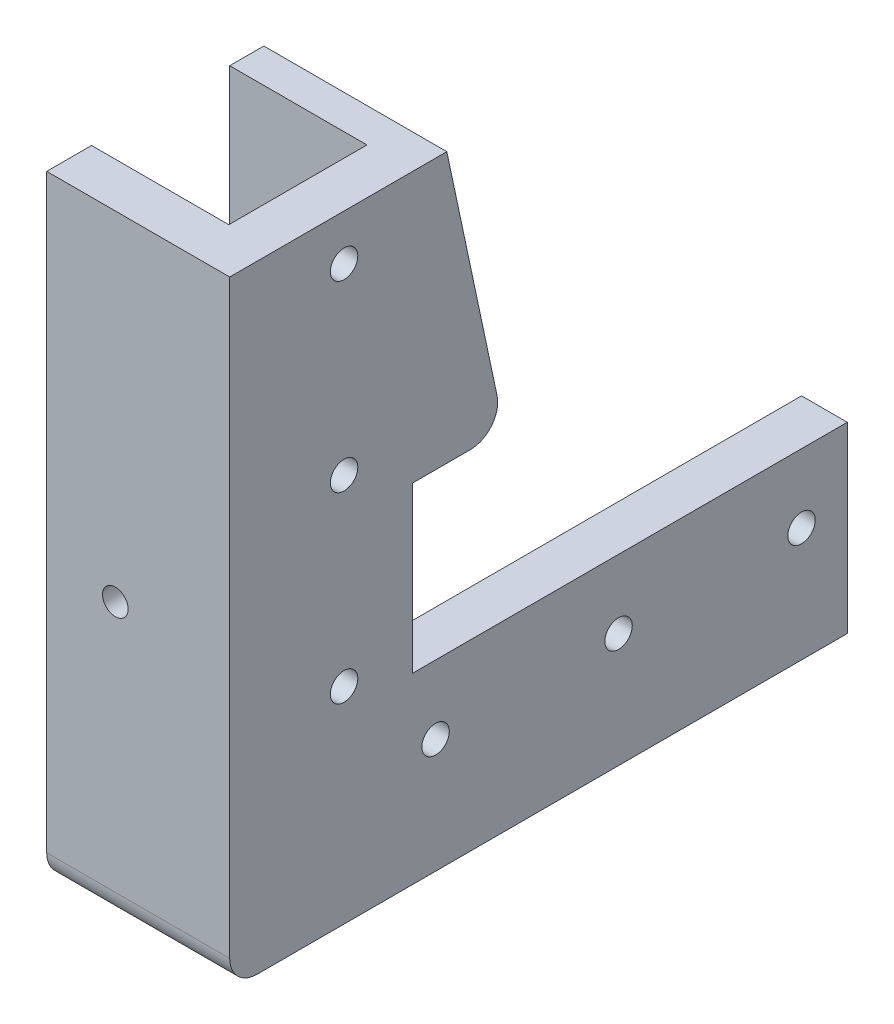
ISO-10303-21;
HEADER;
FILE_DESCRIPTION(('STEP AP214'),'2;1');
FILE_NAME('part.step','',(''),(''),'','','');
FILE_SCHEMA(('AUTOMOTIVE_DESIGN { 1 0 10303 214 1 1 1 1 }'));
ENDSEC;
DATA;
#1=APPLICATION_CONTEXT('core data for automotive mechanical design processes');
#2=APPLICATION_PROTOCOL_DEFINITION('international standard','automotive_design',2000,#1);
#3=PRODUCT_CONTEXT('',#1,'mechanical');
#4=PRODUCT('Part','Part','',(#3));
#5=PRODUCT_RELATED_PRODUCT_CATEGORY('part','',(#4));
#6=PRODUCT_DEFINITION_FORMATION('','',#4);
#7=PRODUCT_DEFINITION_CONTEXT('part definition',#1,'design');
#8=PRODUCT_DEFINITION('design','',#6,#7);
#9=PRODUCT_DEFINITION_SHAPE('','',#8);
#10=(LENGTH_UNIT() NAMED_UNIT(*) SI_UNIT(.MILLI.,.METRE.));
#11=(NAMED_UNIT(*) PLANE_ANGLE_UNIT() SI_UNIT($,.RADIAN.));
#12=(NAMED_UNIT(*) SI_UNIT($,.STERADIAN.) SOLID_ANGLE_UNIT());
#13=UNCERTAINTY_MEASURE_WITH_UNIT(LENGTH_MEASURE(1.E-05),#10,'distance_accuracy_value','');
#14=(GEOMETRIC_REPRESENTATION_CONTEXT(3) GLOBAL_UNCERTAINTY_ASSIGNED_CONTEXT((#13)) GLOBAL_UNIT_ASSIGNED_CONTEXT((#10,
#11,#12)) REPRESENTATION_CONTEXT('',''));
#15=CARTESIAN_POINT('',(0.,0.,0.));
#16=DIRECTION('',(0.,0.,1.));
#17=DIRECTION('',(1.,0.,0.));
#18=AXIS2_PLACEMENT_3D('',#15,#16,#17);
#19=CARTESIAN_POINT('',(0.,0.,0.));
#20=DIRECTION('',(-1.,0.,0.));
#21=DIRECTION('',(0.,0.,1.));
#22=AXIS2_PLACEMENT_3D('',#19,#20,#21);
#23=PLANE('',#22);
#24=DIRECTION('',(0.,0.,-1.));
#25=VECTOR('',#24,1.);
#26=CARTESIAN_POINT('',(0.,-12.5,12.5));
#27=LINE('',#26,#25);
#28=CARTESIAN_POINT('',(0.,-12.5,9.5));
#29=VERTEX_POINT('',#28);
#30=CARTESIAN_POINT('',(0.,-12.5,-55.));
#31=VERTEX_POINT('',#30);
#32=EDGE_CURVE('E238',#29,#31,#27,.T.);
#33=ORIENTED_EDGE('',*,*,#32,.F.);
#34=CARTESIAN_POINT('',(0.,-9.5,9.5));
#35=DIRECTION('',(-1.,0.,0.));
#36=DIRECTION('',(0.,0.,1.));
#37=AXIS2_PLACEMENT_3D('',#34,#35,#36);
#38=CIRCLE('',#37,3.);
#39=CARTESIAN_POINT('',(0.,-9.5,12.5));
#40=VERTEX_POINT('',#39);
#41=EDGE_CURVE('E42',#29,#40,#38,.T.);
#42=ORIENTED_EDGE('',*,*,#41,.T.);
#43=DIRECTION('',(0.,-1.,0.));
#44=VECTOR('',#43,1.);
#45=CARTESIAN_POINT('',(0.,-12.5,12.5));
#46=LINE('',#45,#44);
#47=CARTESIAN_POINT('',(0.,55.,12.5));
#48=VERTEX_POINT('',#47);
#49=EDGE_CURVE('E236',#48,#40,#46,.T.);
#50=ORIENTED_EDGE('',*,*,#49,.F.);
#51=DIRECTION('',(0.,0.,1.));
#52=VECTOR('',#51,1.);
#53=CARTESIAN_POINT('',(0.,55.,-11.2295814307343));
#54=LINE('',#53,#52);
#55=CARTESIAN_POINT('',(0.,55.,7.6));
#56=VERTEX_POINT('',#55);
#57=EDGE_CURVE('E234',#56,#48,#54,.T.);
#58=ORIENTED_EDGE('',*,*,#57,.F.);
#59=DIRECTION('',(0.,1.,0.));
#60=VECTOR('',#59,1.);
#61=CARTESIAN_POINT('',(0.,55.,7.6));
#62=LINE('',#61,#60);
#63=CARTESIAN_POINT('',(0.,-7.59999999999999,7.60000000000001));
#64=VERTEX_POINT('',#63);
#65=EDGE_CURVE('E158',#64,#56,#62,.T.);
#66=ORIENTED_EDGE('',*,*,#65,.F.);
#67=DIRECTION('',(0.,0.,1.));
#68=VECTOR('',#67,1.);
#69=CARTESIAN_POINT('',(0.,-7.59999999999999,7.60000000000001));
#70=LINE('',#69,#68);
#71=CARTESIAN_POINT('',(0.,-7.6,-55.));
#72=VERTEX_POINT('',#71);
#73=EDGE_CURVE('E282',#72,#64,#70,.T.);
#74=ORIENTED_EDGE('',*,*,#73,.F.);
#75=DIRECTION('',(0.,1.,0.));
#76=VECTOR('',#75,1.);
#77=CARTESIAN_POINT('',(0.,-12.5,-55.));
#78=LINE('',#77,#76);
#79=EDGE_CURVE('E213',#31,#72,#78,.T.);
#80=ORIENTED_EDGE('',*,*,#79,.F.);
#81=EDGE_LOOP('',(#33,#42,#50,#58,#66,#74,#80));
#82=FACE_BOUND('',#81,.T.);
#83=ADVANCED_FACE('F34',(#82),#23,.T.);
#84=CARTESIAN_POINT('',(20.,0.,0.));
#85=DIRECTION('',(-1.,0.,0.));
#86=DIRECTION('',(0.,0.,1.));
#87=AXIS2_PLACEMENT_3D('',#84,#85,#86);
#88=PLANE('',#87);
#89=DIRECTION('',(0.,0.,-1.));
#90=VECTOR('',#89,1.);
#91=CARTESIAN_POINT('',(20.,25.5,-7.5));
#92=LINE('',#91,#90);
#93=CARTESIAN_POINT('',(20.,25.5,-7.5));
#94=VERTEX_POINT('',#93);
#95=CARTESIAN_POINT('',(20.,25.5,-13.7953085303948));
#96=VERTEX_POINT('',#95);
#97=EDGE_CURVE('E212',#94,#96,#92,.T.);
#98=ORIENTED_EDGE('',*,*,#97,.T.);
#99=CARTESIAN_POINT('',(20.,28.5,-13.7953085303948));
#100=DIRECTION('',(-1.,0.,0.));
#101=DIRECTION('',(0.,0.,1.));
#102=AXIS2_PLACEMENT_3D('',#99,#100,#101);
#103=CIRCLE('',#102,3.);
#104=CARTESIAN_POINT('',(20.,29.1237350724533,-16.7297513325963));
#105=VERTEX_POINT('',#104);
#106=EDGE_CURVE('E270',#96,#105,#103,.F.);
#107=ORIENTED_EDGE('',*,*,#106,.T.);
#108=DIRECTION('',(0.,0.978147600733806,0.20791169081776));
#109=VECTOR('',#108,1.);
#110=CARTESIAN_POINT('',(20.,25.5,-17.5));
#111=LINE('',#110,#109);
#112=CARTESIAN_POINT('',(20.,55.,-11.2295814307343));
#113=VERTEX_POINT('',#112);
#114=EDGE_CURVE('E216',#105,#113,#111,.T.);
#115=ORIENTED_EDGE('',*,*,#114,.T.);
#116=DIRECTION('',(0.,0.,1.));
#117=VECTOR('',#116,1.);
#118=CARTESIAN_POINT('',(20.,55.,-11.2295814307343));
#119=LINE('',#118,#117);
#120=CARTESIAN_POINT('',(20.,55.,12.5));
#121=VERTEX_POINT('',#120);
#122=EDGE_CURVE('E218',#113,#121,#119,.T.);
#123=ORIENTED_EDGE('',*,*,#122,.T.);
#124=DIRECTION('',(0.,-1.,0.));
#125=VECTOR('',#124,1.);
#126=CARTESIAN_POINT('',(20.,-12.5,12.5));
#127=LINE('',#126,#125);
#128=CARTESIAN_POINT('',(20.,-9.5,12.5));
#129=VERTEX_POINT('',#128);
#130=EDGE_CURVE('E220',#121,#129,#127,.T.);
#131=ORIENTED_EDGE('',*,*,#130,.T.);
#132=CARTESIAN_POINT('',(20.,-9.5,9.5));
#133=DIRECTION('',(-1.,0.,0.));
#134=DIRECTION('',(0.,0.,1.));
#135=AXIS2_PLACEMENT_3D('',#132,#133,#134);
#136=CIRCLE('',#135,3.);
#137=CARTESIAN_POINT('',(20.,-12.5,9.5));
#138=VERTEX_POINT('',#137);
#139=EDGE_CURVE('E268',#129,#138,#136,.F.);
#140=ORIENTED_EDGE('',*,*,#139,.T.);
#141=DIRECTION('',(0.,0.,-1.));
#142=VECTOR('',#141,1.);
#143=CARTESIAN_POINT('',(20.,-12.5,12.5));
#144=LINE('',#143,#142);
#145=CARTESIAN_POINT('',(20.,-12.5,-55.));
#146=VERTEX_POINT('',#145);
#147=EDGE_CURVE('E223',#138,#146,#144,.T.);
#148=ORIENTED_EDGE('',*,*,#147,.T.);
#149=DIRECTION('',(0.,1.,0.));
#150=VECTOR('',#149,1.);
#151=CARTESIAN_POINT('',(20.,-12.5,-55.));
#152=LINE('',#151,#150);
#153=CARTESIAN_POINT('',(20.,7.5,-55.));
#154=VERTEX_POINT('',#153);
#155=EDGE_CURVE('E225',#146,#154,#152,.T.);
#156=ORIENTED_EDGE('',*,*,#155,.T.);
#157=DIRECTION('',(0.,0.,1.));
#158=VECTOR('',#157,1.);
#159=CARTESIAN_POINT('',(20.,7.5,-55.));
#160=LINE('',#159,#158);
#161=CARTESIAN_POINT('',(20.,7.5,-7.5));
#162=VERTEX_POINT('',#161);
#163=EDGE_CURVE('E227',#154,#162,#160,.T.);
#164=ORIENTED_EDGE('',*,*,#163,.T.);
#165=DIRECTION('',(0.,1.,0.));
#166=VECTOR('',#165,1.);
#167=CARTESIAN_POINT('',(20.,7.5,-7.5));
#168=LINE('',#167,#166);
#169=EDGE_CURVE('E209',#162,#94,#168,.T.);
#170=ORIENTED_EDGE('',*,*,#169,.T.);
#171=EDGE_LOOP('',(#98,#107,#115,#123,#131,#140,#148,#156,#164,#170));
#172=FACE_BOUND('',#171,.T.);
#173=CARTESIAN_POINT('',(20.,10.,0.));
#174=DIRECTION('',(1.,0.,0.));
#175=DIRECTION('',(0.,0.,-1.));
#176=AXIS2_PLACEMENT_3D('',#173,#174,#175);
#177=CIRCLE('',#176,1.5);
#178=CARTESIAN_POINT('',(20.,10.,-1.5));
#179=VERTEX_POINT('',#178);
#180=EDGE_CURVE('E205',#179,#179,#177,.T.);
#181=ORIENTED_EDGE('',*,*,#180,.F.);
#182=EDGE_LOOP('',(#181));
#183=FACE_BOUND('',#182,.T.);
#184=CARTESIAN_POINT('',(20.,30.,0.));
#185=DIRECTION('',(1.,0.,0.));
#186=DIRECTION('',(0.,0.,-1.));
#187=AXIS2_PLACEMENT_3D('',#184,#185,#186);
#188=CIRCLE('',#187,1.5);
#189=CARTESIAN_POINT('',(20.,30.,-1.5));
#190=VERTEX_POINT('',#189);
#191=EDGE_CURVE('E202',#190,#190,#188,.T.);
#192=ORIENTED_EDGE('',*,*,#191,.F.);
#193=EDGE_LOOP('',(#192));
#194=FACE_BOUND('',#193,.T.);
#195=CARTESIAN_POINT('',(20.,0.,-10.));
#196=DIRECTION('',(1.,0.,0.));
#197=DIRECTION('',(0.,0.,-1.));
#198=AXIS2_PLACEMENT_3D('',#195,#196,#197);
#199=CIRCLE('',#198,1.5);
#200=CARTESIAN_POINT('',(20.,0.,-11.5));
#201=VERTEX_POINT('',#200);
#202=EDGE_CURVE('E199',#201,#201,#199,.T.);
#203=ORIENTED_EDGE('',*,*,#202,.F.);
#204=EDGE_LOOP('',(#203));
#205=FACE_BOUND('',#204,.T.);
#206=CARTESIAN_POINT('',(20.,0.,-30.));
#207=DIRECTION('',(1.,0.,0.));
#208=DIRECTION('',(0.,0.,-1.));
#209=AXIS2_PLACEMENT_3D('',#206,#207,#208);
#210=CIRCLE('',#209,1.5);
#211=CARTESIAN_POINT('',(20.,0.,-31.5));
#212=VERTEX_POINT('',#211);
#213=EDGE_CURVE('E196',#212,#212,#210,.T.);
#214=ORIENTED_EDGE('',*,*,#213,.F.);
#215=EDGE_LOOP('',(#214));
#216=FACE_BOUND('',#215,.T.);
#217=CARTESIAN_POINT('',(20.,0.,-50.));
#218=DIRECTION('',(1.,0.,0.));
#219=DIRECTION('',(0.,0.,-1.));
#220=AXIS2_PLACEMENT_3D('',#217,#218,#219);
#221=CIRCLE('',#220,1.5);
#222=CARTESIAN_POINT('',(20.,0.,-51.5));
#223=VERTEX_POINT('',#222);
#224=EDGE_CURVE('E193',#223,#223,#221,.T.);
#225=ORIENTED_EDGE('',*,*,#224,.F.);
#226=EDGE_LOOP('',(#225));
#227=FACE_BOUND('',#226,.T.);
#228=CARTESIAN_POINT('',(20.,50.,0.));
#229=DIRECTION('',(1.,0.,0.));
#230=DIRECTION('',(0.,0.,-1.));
#231=AXIS2_PLACEMENT_3D('',#228,#229,#230);
#232=CIRCLE('',#231,1.5);
#233=CARTESIAN_POINT('',(20.,50.,-1.5));
#234=VERTEX_POINT('',#233);
#235=EDGE_CURVE('E190',#234,#234,#232,.T.);
#236=ORIENTED_EDGE('',*,*,#235,.F.);
#237=EDGE_LOOP('',(#236));
#238=FACE_BOUND('',#237,.T.);
#239=ADVANCED_FACE('F291',(#172,#183,#194,#205,#216,#227,#238),#88,.F.);
#240=DIRECTION('',(0.,0.978147600733806,0.20791169081776));
#241=VECTOR('',#240,1.);
#242=CARTESIAN_POINT('',(0.,25.5,-17.5));
#243=LINE('',#242,#241);
#244=CARTESIAN_POINT('',(0.,29.1237350724533,-16.7297513325963));
#245=VERTEX_POINT('',#244);
#246=CARTESIAN_POINT('',(0.,55.,-11.2295814307343));
#247=VERTEX_POINT('',#246);
#248=EDGE_CURVE('E232',#245,#247,#243,.T.);
#249=ORIENTED_EDGE('',*,*,#248,.F.);
#250=CARTESIAN_POINT('',(0.,28.5,-13.7953085303948));
#251=DIRECTION('',(-1.,0.,0.));
#252=DIRECTION('',(0.,0.,1.));
#253=AXIS2_PLACEMENT_3D('',#250,#251,#252);
#254=CIRCLE('',#253,3.);
#255=CARTESIAN_POINT('',(0.,25.5,-13.7953085303948));
#256=VERTEX_POINT('',#255);
#257=EDGE_CURVE('E264',#245,#256,#254,.T.);
#258=ORIENTED_EDGE('',*,*,#257,.T.);
#259=DIRECTION('',(0.,0.,-1.));
#260=VECTOR('',#259,1.);
#261=CARTESIAN_POINT('',(0.,25.5,-7.5));
#262=LINE('',#261,#260);
#263=CARTESIAN_POINT('',(0.,25.5,-7.5));
#264=VERTEX_POINT('',#263);
#265=EDGE_CURVE('E208',#264,#256,#262,.T.);
#266=ORIENTED_EDGE('',*,*,#265,.F.);
#267=DIRECTION('',(0.,-1.,0.));
#268=VECTOR('',#267,1.);
#269=CARTESIAN_POINT('',(0.,7.5,-7.5));
#270=LINE('',#269,#268);
#271=CARTESIAN_POINT('',(0.,55.,-7.5));
#272=VERTEX_POINT('',#271);
#273=EDGE_CURVE('E305',#272,#264,#270,.T.);
#274=ORIENTED_EDGE('',*,*,#273,.F.);
#275=EDGE_CURVE('E164',#247,#272,#54,.T.);
#276=ORIENTED_EDGE('',*,*,#275,.F.);
#277=EDGE_LOOP('',(#249,#258,#266,#274,#276));
#278=FACE_BOUND('',#277,.T.);
#279=ADVANCED_FACE('F350',(#278),#23,.T.);
#280=CARTESIAN_POINT('',(20.,7.5,-7.5));
#281=DIRECTION('',(0.,0.,1.));
#282=DIRECTION('',(1.,0.,0.));
#283=AXIS2_PLACEMENT_3D('',#280,#281,#282);
#284=PLANE('',#283);
#285=DIRECTION('',(-1.,0.,0.));
#286=VECTOR('',#285,1.);
#287=CARTESIAN_POINT('',(20.,7.5,-7.5));
#288=LINE('',#287,#286);
#289=CARTESIAN_POINT('',(15.,7.5,-7.5));
#290=VERTEX_POINT('',#289);
#291=EDGE_CURVE('E229',#162,#290,#288,.T.);
#292=ORIENTED_EDGE('',*,*,#291,.T.);
#293=DIRECTION('',(0.,-1.,0.));
#294=VECTOR('',#293,1.);
#295=CARTESIAN_POINT('',(15.,7.5,-7.5));
#296=LINE('',#295,#294);
#297=CARTESIAN_POINT('',(15.,25.5,-7.5));
#298=VERTEX_POINT('',#297);
#299=EDGE_CURVE('E147',#298,#290,#296,.T.);
#300=ORIENTED_EDGE('',*,*,#299,.F.);
#301=DIRECTION('',(-1.,0.,0.));
#302=VECTOR('',#301,1.);
#303=CARTESIAN_POINT('',(20.,25.5,-7.5));
#304=LINE('',#303,#302);
#305=EDGE_CURVE('E255',#94,#298,#304,.T.);
#306=ORIENTED_EDGE('',*,*,#305,.F.);
#307=ORIENTED_EDGE('',*,*,#169,.F.);
#308=EDGE_LOOP('',(#292,#300,#306,#307));
#309=FACE_BOUND('',#308,.T.);
#310=ADVANCED_FACE('F338',(#309),#284,.F.);
#311=CARTESIAN_POINT('',(20.,25.5,-7.5));
#312=DIRECTION('',(0.,1.,0.));
#313=DIRECTION('',(0.,0.,1.));
#314=AXIS2_PLACEMENT_3D('',#311,#312,#313);
#315=PLANE('',#314);
#316=ORIENTED_EDGE('',*,*,#265,.T.);
#317=DIRECTION('',(-1.,0.,0.));
#318=VECTOR('',#317,1.);
#319=CARTESIAN_POINT('',(20.,25.5,-13.7953085303948));
#320=LINE('',#319,#318);
#321=EDGE_CURVE('E266',#256,#96,#320,.F.);
#322=ORIENTED_EDGE('',*,*,#321,.T.);
#323=ORIENTED_EDGE('',*,*,#97,.F.);
#324=ORIENTED_EDGE('',*,*,#305,.T.);
#325=DIRECTION('',(-1.,0.,0.));
#326=VECTOR('',#325,1.);
#327=CARTESIAN_POINT('',(20.,25.5,-7.5));
#328=LINE('',#327,#326);
#329=EDGE_CURVE('E143',#298,#264,#328,.T.);
#330=ORIENTED_EDGE('',*,*,#329,.T.);
#331=EDGE_LOOP('',(#316,#322,#323,#324,#330));
#332=FACE_BOUND('',#331,.T.);
#333=ADVANCED_FACE('F352',(#332),#315,.F.);
#334=CARTESIAN_POINT('',(20.,25.5,-17.5));
#335=DIRECTION('',(0.,-0.20791169081776,0.978147600733806));
#336=DIRECTION('',(0.,-0.978147600733806,-0.20791169081776));
#337=AXIS2_PLACEMENT_3D('',#334,#335,#336);
#338=PLANE('',#337);
#339=ORIENTED_EDGE('',*,*,#114,.F.);
#340=DIRECTION('',(-1.,0.,0.));
#341=VECTOR('',#340,1.);
#342=CARTESIAN_POINT('',(20.,29.1237350724533,-16.7297513325963));
#343=LINE('',#342,#341);
#344=EDGE_CURVE('E258',#105,#245,#343,.T.);
#345=ORIENTED_EDGE('',*,*,#344,.T.);
#346=ORIENTED_EDGE('',*,*,#248,.T.);
#347=DIRECTION('',(-1.,0.,0.));
#348=VECTOR('',#347,1.);
#349=CARTESIAN_POINT('',(20.,55.,-11.2295814307343));
#350=LINE('',#349,#348);
#351=EDGE_CURVE('E253',#113,#247,#350,.T.);
#352=ORIENTED_EDGE('',*,*,#351,.F.);
#353=EDGE_LOOP('',(#339,#345,#346,#352));
#354=FACE_BOUND('',#353,.T.);
#355=ADVANCED_FACE('F347',(#354),#338,.F.);
#356=CARTESIAN_POINT('',(20.,55.,-11.2295814307343));
#357=DIRECTION('',(0.,-1.,0.));
#358=DIRECTION('',(0.,0.,-1.));
#359=AXIS2_PLACEMENT_3D('',#356,#357,#358);
#360=PLANE('',#359);
#361=DIRECTION('',(0.,0.,-1.));
#362=VECTOR('',#361,1.);
#363=CARTESIAN_POINT('',(15.,55.,-7.5));
#364=LINE('',#363,#362);
#365=CARTESIAN_POINT('',(15.,55.,7.6));
#366=VERTEX_POINT('',#365);
#367=CARTESIAN_POINT('',(15.,55.,-7.5));
#368=VERTEX_POINT('',#367);
#369=EDGE_CURVE('E151',#366,#368,#364,.T.);
#370=ORIENTED_EDGE('',*,*,#369,.F.);
#371=DIRECTION('',(-1.,0.,0.));
#372=VECTOR('',#371,1.);
#373=CARTESIAN_POINT('',(15.,55.,7.6));
#374=LINE('',#373,#372);
#375=EDGE_CURVE('E261',#366,#56,#374,.T.);
#376=ORIENTED_EDGE('',*,*,#375,.T.);
#377=ORIENTED_EDGE('',*,*,#57,.T.);
#378=DIRECTION('',(-1.,0.,0.));
#379=VECTOR('',#378,1.);
#380=CARTESIAN_POINT('',(20.,55.,12.5));
#381=LINE('',#380,#379);
#382=EDGE_CURVE('E250',#121,#48,#381,.T.);
#383=ORIENTED_EDGE('',*,*,#382,.F.);
#384=ORIENTED_EDGE('',*,*,#122,.F.);
#385=ORIENTED_EDGE('',*,*,#351,.T.);
#386=ORIENTED_EDGE('',*,*,#275,.T.);
#387=DIRECTION('',(-1.,0.,0.));
#388=VECTOR('',#387,1.);
#389=CARTESIAN_POINT('',(15.,55.,-7.5));
#390=LINE('',#389,#388);
#391=EDGE_CURVE('E140',#368,#272,#390,.T.);
#392=ORIENTED_EDGE('',*,*,#391,.F.);
#393=EDGE_LOOP('',(#370,#376,#377,#383,#384,#385,#386,#392));
#394=FACE_BOUND('',#393,.T.);
#395=ADVANCED_FACE('F161',(#394),#360,.F.);
#396=CARTESIAN_POINT('',(20.,-12.5,12.5));
#397=DIRECTION('',(0.,0.,-1.));
#398=DIRECTION('',(-1.,0.,0.));
#399=AXIS2_PLACEMENT_3D('',#396,#397,#398);
#400=PLANE('',#399);
#401=CARTESIAN_POINT('',(7.5,18.,12.5));
#402=DIRECTION('',(0.,0.,-1.));
#403=DIRECTION('',(0.,1.,0.));
#404=AXIS2_PLACEMENT_3D('',#401,#402,#403);
#405=CIRCLE('',#404,1.4);
#406=CARTESIAN_POINT('',(7.5,19.4,12.5));
#407=VERTEX_POINT('',#406);
#408=EDGE_CURVE('E306',#407,#407,#405,.T.);
#409=ORIENTED_EDGE('',*,*,#408,.T.);
#410=EDGE_LOOP('',(#409));
#411=FACE_BOUND('',#410,.T.);
#412=ORIENTED_EDGE('',*,*,#49,.T.);
#413=DIRECTION('',(-1.,0.,0.));
#414=VECTOR('',#413,1.);
#415=CARTESIAN_POINT('',(20.,-9.5,12.5));
#416=LINE('',#415,#414);
#417=EDGE_CURVE('E11',#40,#129,#416,.F.);
#418=ORIENTED_EDGE('',*,*,#417,.T.);
#419=ORIENTED_EDGE('',*,*,#130,.F.);
#420=ORIENTED_EDGE('',*,*,#382,.T.);
#421=EDGE_LOOP('',(#412,#418,#419,#420));
#422=FACE_BOUND('',#421,.T.);
#423=ADVANCED_FACE('F296',(#411,#422),#400,.F.);
#424=CARTESIAN_POINT('',(20.,-12.5,12.5));
#425=DIRECTION('',(0.,1.,0.));
#426=DIRECTION('',(0.,0.,1.));
#427=AXIS2_PLACEMENT_3D('',#424,#425,#426);
#428=PLANE('',#427);
#429=ORIENTED_EDGE('',*,*,#147,.F.);
#430=DIRECTION('',(-1.,0.,0.));
#431=VECTOR('',#430,1.);
#432=CARTESIAN_POINT('',(20.,-12.5,9.5));
#433=LINE('',#432,#431);
#434=EDGE_CURVE('E272',#138,#29,#433,.T.);
#435=ORIENTED_EDGE('',*,*,#434,.T.);
#436=ORIENTED_EDGE('',*,*,#32,.T.);
#437=DIRECTION('',(-1.,0.,0.));
#438=VECTOR('',#437,1.);
#439=CARTESIAN_POINT('',(20.,-12.5,-55.));
#440=LINE('',#439,#438);
#441=EDGE_CURVE('E247',#146,#31,#440,.T.);
#442=ORIENTED_EDGE('',*,*,#441,.F.);
#443=EDGE_LOOP('',(#429,#435,#436,#442));
#444=FACE_BOUND('',#443,.T.);
#445=ADVANCED_FACE('F275',(#444),#428,.F.);
#446=CARTESIAN_POINT('',(20.,-12.5,-55.));
#447=DIRECTION('',(0.,0.,1.));
#448=DIRECTION('',(1.,0.,0.));
#449=AXIS2_PLACEMENT_3D('',#446,#447,#448);
#450=PLANE('',#449);
#451=ORIENTED_EDGE('',*,*,#79,.T.);
#452=DIRECTION('',(-1.,0.,0.));
#453=VECTOR('',#452,1.);
#454=CARTESIAN_POINT('',(15.,-7.6,-55.));
#455=LINE('',#454,#453);
#456=CARTESIAN_POINT('',(15.,-7.6,-55.));
#457=VERTEX_POINT('',#456);
#458=EDGE_CURVE('E165',#457,#72,#455,.T.);
#459=ORIENTED_EDGE('',*,*,#458,.F.);
#460=DIRECTION('',(0.,-1.,0.));
#461=VECTOR('',#460,1.);
#462=CARTESIAN_POINT('',(15.,-7.6,-55.));
#463=LINE('',#462,#461);
#464=CARTESIAN_POINT('',(15.,7.5,-55.));
#465=VERTEX_POINT('',#464);
#466=EDGE_CURVE('E309',#465,#457,#463,.T.);
#467=ORIENTED_EDGE('',*,*,#466,.F.);
#468=DIRECTION('',(-1.,0.,0.));
#469=VECTOR('',#468,1.);
#470=CARTESIAN_POINT('',(20.,7.5,-55.));
#471=LINE('',#470,#469);
#472=EDGE_CURVE('E244',#154,#465,#471,.T.);
#473=ORIENTED_EDGE('',*,*,#472,.F.);
#474=ORIENTED_EDGE('',*,*,#155,.F.);
#475=ORIENTED_EDGE('',*,*,#441,.T.);
#476=EDGE_LOOP('',(#451,#459,#467,#473,#474,#475));
#477=FACE_BOUND('',#476,.T.);
#478=ADVANCED_FACE('F285',(#477),#450,.F.);
#479=CARTESIAN_POINT('',(20.,7.5,-55.));
#480=DIRECTION('',(0.,-1.,0.));
#481=DIRECTION('',(0.,0.,-1.));
#482=AXIS2_PLACEMENT_3D('',#479,#480,#481);
#483=PLANE('',#482);
#484=ORIENTED_EDGE('',*,*,#472,.T.);
#485=DIRECTION('',(0.,0.,-1.));
#486=VECTOR('',#485,1.);
#487=CARTESIAN_POINT('',(15.,7.5,-55.));
#488=LINE('',#487,#486);
#489=EDGE_CURVE('E146',#290,#465,#488,.T.);
#490=ORIENTED_EDGE('',*,*,#489,.F.);
#491=ORIENTED_EDGE('',*,*,#291,.F.);
#492=ORIENTED_EDGE('',*,*,#163,.F.);
#493=EDGE_LOOP('',(#484,#490,#491,#492));
#494=FACE_BOUND('',#493,.T.);
#495=ADVANCED_FACE('F334',(#494),#483,.F.);
#496=CARTESIAN_POINT('',(20.,10.,0.));
#497=DIRECTION('',(-1.,0.,0.));
#498=DIRECTION('',(0.,0.,1.));
#499=AXIS2_PLACEMENT_3D('',#496,#497,#498);
#500=CYLINDRICAL_SURFACE('',#499,1.5);
#501=CARTESIAN_POINT('',(15.,10.,0.));
#502=DIRECTION('',(1.,0.,0.));
#503=DIRECTION('',(0.,0.,-1.));
#504=AXIS2_PLACEMENT_3D('',#501,#502,#503);
#505=CIRCLE('',#504,1.5);
#506=CARTESIAN_POINT('',(15.,10.,-1.5));
#507=VERTEX_POINT('',#506);
#508=EDGE_CURVE('E186',#507,#507,#505,.T.);
#509=ORIENTED_EDGE('',*,*,#508,.F.);
#510=EDGE_LOOP('',(#509));
#511=FACE_BOUND('',#510,.T.);
#512=ORIENTED_EDGE('',*,*,#180,.T.);
#513=EDGE_LOOP('',(#512));
#514=FACE_BOUND('',#513,.T.);
#515=ADVANCED_FACE('F408',(#511,#514),#500,.F.);
#516=CARTESIAN_POINT('',(20.,30.,0.));
#517=DIRECTION('',(-1.,0.,0.));
#518=DIRECTION('',(0.,0.,1.));
#519=AXIS2_PLACEMENT_3D('',#516,#517,#518);
#520=CYLINDRICAL_SURFACE('',#519,1.5);
#521=CARTESIAN_POINT('',(15.,30.,0.));
#522=DIRECTION('',(1.,0.,0.));
#523=DIRECTION('',(0.,0.,-1.));
#524=AXIS2_PLACEMENT_3D('',#521,#522,#523);
#525=CIRCLE('',#524,1.5);
#526=CARTESIAN_POINT('',(15.,30.,-1.5));
#527=VERTEX_POINT('',#526);
#528=EDGE_CURVE('E183',#527,#527,#525,.T.);
#529=ORIENTED_EDGE('',*,*,#528,.F.);
#530=EDGE_LOOP('',(#529));
#531=FACE_BOUND('',#530,.T.);
#532=ORIENTED_EDGE('',*,*,#191,.T.);
#533=EDGE_LOOP('',(#532));
#534=FACE_BOUND('',#533,.T.);
#535=ADVANCED_FACE('F416',(#531,#534),#520,.F.);
#536=CARTESIAN_POINT('',(20.,0.,-10.));
#537=DIRECTION('',(-1.,0.,0.));
#538=DIRECTION('',(0.,0.,1.));
#539=AXIS2_PLACEMENT_3D('',#536,#537,#538);
#540=CYLINDRICAL_SURFACE('',#539,1.5);
#541=CARTESIAN_POINT('',(15.,0.,-10.));
#542=DIRECTION('',(1.,0.,0.));
#543=DIRECTION('',(0.,0.,-1.));
#544=AXIS2_PLACEMENT_3D('',#541,#542,#543);
#545=CIRCLE('',#544,1.5);
#546=CARTESIAN_POINT('',(15.,0.,-11.5));
#547=VERTEX_POINT('',#546);
#548=EDGE_CURVE('E180',#547,#547,#545,.T.);
#549=ORIENTED_EDGE('',*,*,#548,.F.);
#550=EDGE_LOOP('',(#549));
#551=FACE_BOUND('',#550,.T.);
#552=ORIENTED_EDGE('',*,*,#202,.T.);
#553=EDGE_LOOP('',(#552));
#554=FACE_BOUND('',#553,.T.);
#555=ADVANCED_FACE('F426',(#551,#554),#540,.F.);
#556=CARTESIAN_POINT('',(20.,0.,-30.));
#557=DIRECTION('',(-1.,0.,0.));
#558=DIRECTION('',(0.,0.,1.));
#559=AXIS2_PLACEMENT_3D('',#556,#557,#558);
#560=CYLINDRICAL_SURFACE('',#559,1.5);
#561=CARTESIAN_POINT('',(15.,0.,-30.));
#562=DIRECTION('',(1.,0.,0.));
#563=DIRECTION('',(0.,0.,-1.));
#564=AXIS2_PLACEMENT_3D('',#561,#562,#563);
#565=CIRCLE('',#564,1.5);
#566=CARTESIAN_POINT('',(15.,0.,-31.5));
#567=VERTEX_POINT('',#566);
#568=EDGE_CURVE('E176',#567,#567,#565,.T.);
#569=ORIENTED_EDGE('',*,*,#568,.F.);
#570=EDGE_LOOP('',(#569));
#571=FACE_BOUND('',#570,.T.);
#572=ORIENTED_EDGE('',*,*,#213,.T.);
#573=EDGE_LOOP('',(#572));
#574=FACE_BOUND('',#573,.T.);
#575=ADVANCED_FACE('F436',(#571,#574),#560,.F.);
#576=CARTESIAN_POINT('',(20.,0.,-50.));
#577=DIRECTION('',(-1.,0.,0.));
#578=DIRECTION('',(0.,0.,1.));
#579=AXIS2_PLACEMENT_3D('',#576,#577,#578);
#580=CYLINDRICAL_SURFACE('',#579,1.5);
#581=CARTESIAN_POINT('',(15.,0.,-50.));
#582=DIRECTION('',(1.,0.,0.));
#583=DIRECTION('',(0.,0.,-1.));
#584=AXIS2_PLACEMENT_3D('',#581,#582,#583);
#585=CIRCLE('',#584,1.5);
#586=CARTESIAN_POINT('',(15.,0.,-51.5));
#587=VERTEX_POINT('',#586);
#588=EDGE_CURVE('E173',#587,#587,#585,.T.);
#589=ORIENTED_EDGE('',*,*,#588,.F.);
#590=EDGE_LOOP('',(#589));
#591=FACE_BOUND('',#590,.T.);
#592=ORIENTED_EDGE('',*,*,#224,.T.);
#593=EDGE_LOOP('',(#592));
#594=FACE_BOUND('',#593,.T.);
#595=ADVANCED_FACE('F446',(#591,#594),#580,.F.);
#596=CARTESIAN_POINT('',(20.,50.,0.));
#597=DIRECTION('',(-1.,0.,0.));
#598=DIRECTION('',(0.,0.,1.));
#599=AXIS2_PLACEMENT_3D('',#596,#597,#598);
#600=CYLINDRICAL_SURFACE('',#599,1.5);
#601=CARTESIAN_POINT('',(15.,50.,0.));
#602=DIRECTION('',(1.,0.,0.));
#603=DIRECTION('',(0.,0.,-1.));
#604=AXIS2_PLACEMENT_3D('',#601,#602,#603);
#605=CIRCLE('',#604,1.5);
#606=CARTESIAN_POINT('',(15.,50.,-1.5));
#607=VERTEX_POINT('',#606);
#608=EDGE_CURVE('E177',#607,#607,#605,.T.);
#609=ORIENTED_EDGE('',*,*,#608,.F.);
#610=EDGE_LOOP('',(#609));
#611=FACE_BOUND('',#610,.T.);
#612=ORIENTED_EDGE('',*,*,#235,.T.);
#613=EDGE_LOOP('',(#612));
#614=FACE_BOUND('',#613,.T.);
#615=ADVANCED_FACE('F456',(#611,#614),#600,.F.);
#616=CARTESIAN_POINT('',(15.,7.5,-7.5));
#617=DIRECTION('',(0.,0.,-1.));
#618=DIRECTION('',(-1.,0.,0.));
#619=AXIS2_PLACEMENT_3D('',#616,#617,#618);
#620=PLANE('',#619);
#621=EDGE_CURVE('E136',#368,#298,#296,.T.);
#622=ORIENTED_EDGE('',*,*,#621,.F.);
#623=ORIENTED_EDGE('',*,*,#391,.T.);
#624=ORIENTED_EDGE('',*,*,#273,.T.);
#625=ORIENTED_EDGE('',*,*,#329,.F.);
#626=EDGE_LOOP('',(#622,#623,#624,#625));
#627=FACE_BOUND('',#626,.T.);
#628=ADVANCED_FACE('F138',(#627),#620,.F.);
#629=CARTESIAN_POINT('',(15.,55.,7.6));
#630=DIRECTION('',(0.,0.,1.));
#631=DIRECTION('',(0.,-1.,0.));
#632=AXIS2_PLACEMENT_3D('',#629,#630,#631);
#633=PLANE('',#632);
#634=CARTESIAN_POINT('',(7.5,18.,7.6));
#635=DIRECTION('',(0.,0.,-1.));
#636=DIRECTION('',(0.,1.,0.));
#637=AXIS2_PLACEMENT_3D('',#634,#635,#636);
#638=CIRCLE('',#637,1.4);
#639=CARTESIAN_POINT('',(7.5,19.4,7.6));
#640=VERTEX_POINT('',#639);
#641=EDGE_CURVE('E313',#640,#640,#638,.T.);
#642=ORIENTED_EDGE('',*,*,#641,.F.);
#643=EDGE_LOOP('',(#642));
#644=FACE_BOUND('',#643,.T.);
#645=ORIENTED_EDGE('',*,*,#65,.T.);
#646=ORIENTED_EDGE('',*,*,#375,.F.);
#647=DIRECTION('',(0.,1.,0.));
#648=VECTOR('',#647,1.);
#649=CARTESIAN_POINT('',(15.,55.,7.6));
#650=LINE('',#649,#648);
#651=CARTESIAN_POINT('',(15.,-7.59999999999999,7.60000000000001));
#652=VERTEX_POINT('',#651);
#653=EDGE_CURVE('E155',#652,#366,#650,.T.);
#654=ORIENTED_EDGE('',*,*,#653,.F.);
#655=DIRECTION('',(-1.,0.,0.));
#656=VECTOR('',#655,1.);
#657=CARTESIAN_POINT('',(15.,-7.59999999999999,7.60000000000001));
#658=LINE('',#657,#656);
#659=EDGE_CURVE('E167',#652,#64,#658,.T.);
#660=ORIENTED_EDGE('',*,*,#659,.T.);
#661=EDGE_LOOP('',(#645,#646,#654,#660));
#662=FACE_BOUND('',#661,.T.);
#663=ADVANCED_FACE('F327',(#644,#662),#633,.F.);
#664=CARTESIAN_POINT('',(15.,-7.59999999999999,7.60000000000001));
#665=DIRECTION('',(0.,-1.,0.));
#666=DIRECTION('',(0.,0.,-1.));
#667=AXIS2_PLACEMENT_3D('',#664,#665,#666);
#668=PLANE('',#667);
#669=ORIENTED_EDGE('',*,*,#73,.T.);
#670=ORIENTED_EDGE('',*,*,#659,.F.);
#671=DIRECTION('',(0.,0.,1.));
#672=VECTOR('',#671,1.);
#673=CARTESIAN_POINT('',(15.,-7.59999999999999,7.60000000000001));
#674=LINE('',#673,#672);
#675=EDGE_CURVE('E169',#457,#652,#674,.T.);
#676=ORIENTED_EDGE('',*,*,#675,.F.);
#677=ORIENTED_EDGE('',*,*,#458,.T.);
#678=EDGE_LOOP('',(#669,#670,#676,#677));
#679=FACE_BOUND('',#678,.T.);
#680=ADVANCED_FACE('F329',(#679),#668,.F.);
#681=CARTESIAN_POINT('',(15.,0.,0.));
#682=DIRECTION('',(1.,0.,0.));
#683=DIRECTION('',(0.,0.,-1.));
#684=AXIS2_PLACEMENT_3D('',#681,#682,#683);
#685=PLANE('',#684);
#686=ORIENTED_EDGE('',*,*,#508,.T.);
#687=EDGE_LOOP('',(#686));
#688=FACE_BOUND('',#687,.T.);
#689=ORIENTED_EDGE('',*,*,#528,.T.);
#690=EDGE_LOOP('',(#689));
#691=FACE_BOUND('',#690,.T.);
#692=ORIENTED_EDGE('',*,*,#548,.T.);
#693=EDGE_LOOP('',(#692));
#694=FACE_BOUND('',#693,.T.);
#695=ORIENTED_EDGE('',*,*,#568,.T.);
#696=EDGE_LOOP('',(#695));
#697=FACE_BOUND('',#696,.T.);
#698=ORIENTED_EDGE('',*,*,#588,.T.);
#699=EDGE_LOOP('',(#698));
#700=FACE_BOUND('',#699,.T.);
#701=ORIENTED_EDGE('',*,*,#608,.T.);
#702=EDGE_LOOP('',(#701));
#703=FACE_BOUND('',#702,.T.);
#704=ORIENTED_EDGE('',*,*,#369,.T.);
#705=ORIENTED_EDGE('',*,*,#621,.T.);
#706=ORIENTED_EDGE('',*,*,#299,.T.);
#707=ORIENTED_EDGE('',*,*,#489,.T.);
#708=ORIENTED_EDGE('',*,*,#466,.T.);
#709=ORIENTED_EDGE('',*,*,#675,.T.);
#710=ORIENTED_EDGE('',*,*,#653,.T.);
#711=EDGE_LOOP('',(#704,#705,#706,#707,#708,#709,#710));
#712=FACE_BOUND('',#711,.T.);
#713=ADVANCED_FACE('F152',(#688,#691,#694,#697,#700,#703,#712),#685,.F.);
#714=CARTESIAN_POINT('',(7.5,18.,12.5));
#715=DIRECTION('',(0.,0.,-1.));
#716=DIRECTION('',(0.,1.,0.));
#717=AXIS2_PLACEMENT_3D('',#714,#715,#716);
#718=CYLINDRICAL_SURFACE('',#717,1.4);
#719=ORIENTED_EDGE('',*,*,#408,.F.);
#720=EDGE_LOOP('',(#719));
#721=FACE_BOUND('',#720,.T.);
#722=ORIENTED_EDGE('',*,*,#641,.T.);
#723=EDGE_LOOP('',(#722));
#724=FACE_BOUND('',#723,.T.);
#725=ADVANCED_FACE('F320',(#721,#724),#718,.F.);
#726=CARTESIAN_POINT('',(20.,28.5,-13.7953085303948));
#727=DIRECTION('',(-1.,0.,0.));
#728=DIRECTION('',(0.,0.,1.));
#729=AXIS2_PLACEMENT_3D('',#726,#727,#728);
#730=CYLINDRICAL_SURFACE('',#729,3.);
#731=ORIENTED_EDGE('',*,*,#106,.F.);
#732=ORIENTED_EDGE('',*,*,#321,.F.);
#733=ORIENTED_EDGE('',*,*,#257,.F.);
#734=ORIENTED_EDGE('',*,*,#344,.F.);
#735=EDGE_LOOP('',(#731,#732,#733,#734));
#736=FACE_BOUND('',#735,.T.);
#737=ADVANCED_FACE('F323',(#736),#730,.T.);
#738=CARTESIAN_POINT('',(20.,-9.5,9.5));
#739=DIRECTION('',(-1.,0.,0.));
#740=DIRECTION('',(0.,0.,1.));
#741=AXIS2_PLACEMENT_3D('',#738,#739,#740);
#742=CYLINDRICAL_SURFACE('',#741,3.);
#743=ORIENTED_EDGE('',*,*,#139,.F.);
#744=ORIENTED_EDGE('',*,*,#417,.F.);
#745=ORIENTED_EDGE('',*,*,#41,.F.);
#746=ORIENTED_EDGE('',*,*,#434,.F.);
#747=EDGE_LOOP('',(#743,#744,#745,#746));
#748=FACE_BOUND('',#747,.T.);
#749=ADVANCED_FACE('F36',(#748),#742,.T.);
#750=CLOSED_SHELL('',(#83,#239,#279,#310,#333,#355,#395,#423,#445,#478,#495,#515,#535,#555,#575,
#595,#615,#628,#663,#680,#713,#725,#737,#749));
#751=MANIFOLD_SOLID_BREP('B2',#750);
#752=ADVANCED_BREP_SHAPE_REPRESENTATION('',(#18,#751),#14);
#753=SHAPE_DEFINITION_REPRESENTATION(#9,#752);
ENDSEC;
END-ISO-10303-21;
